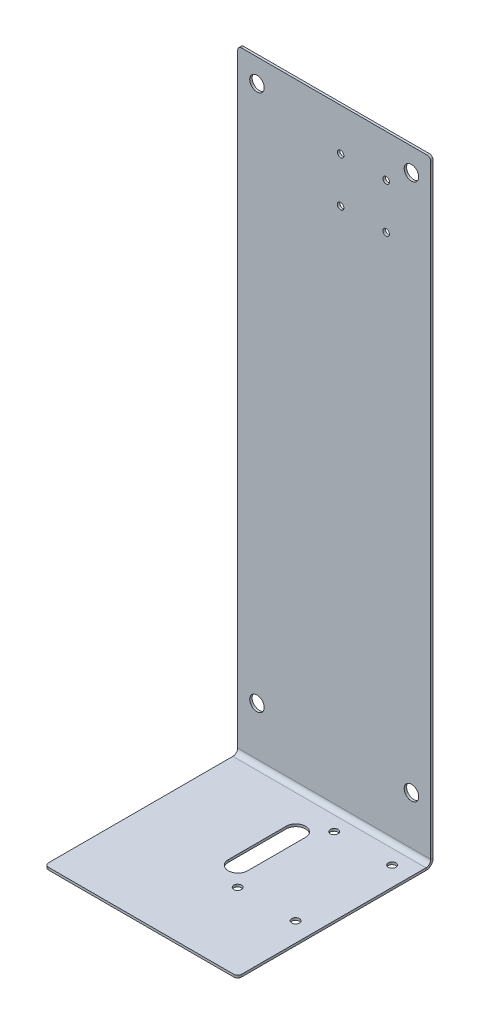
ISO-10303-21;
HEADER;
FILE_DESCRIPTION(('STEP AP214'),'2;1');
FILE_NAME('part.step','',(''),(''),'','','');
FILE_SCHEMA(('AUTOMOTIVE_DESIGN { 1 0 10303 214 1 1 1 1 }'));
ENDSEC;
DATA;
#1=APPLICATION_CONTEXT('core data for automotive mechanical design processes');
#2=APPLICATION_PROTOCOL_DEFINITION('international standard','automotive_design',2000,#1);
#3=PRODUCT_CONTEXT('',#1,'mechanical');
#4=PRODUCT('Part','Part','',(#3));
#5=PRODUCT_RELATED_PRODUCT_CATEGORY('part','',(#4));
#6=PRODUCT_DEFINITION_FORMATION('','',#4);
#7=PRODUCT_DEFINITION_CONTEXT('part definition',#1,'design');
#8=PRODUCT_DEFINITION('design','',#6,#7);
#9=PRODUCT_DEFINITION_SHAPE('','',#8);
#10=(LENGTH_UNIT() NAMED_UNIT(*) SI_UNIT(.MILLI.,.METRE.));
#11=(NAMED_UNIT(*) PLANE_ANGLE_UNIT() SI_UNIT($,.RADIAN.));
#12=(NAMED_UNIT(*) SI_UNIT($,.STERADIAN.) SOLID_ANGLE_UNIT());
#13=UNCERTAINTY_MEASURE_WITH_UNIT(LENGTH_MEASURE(1.E-05),#10,'distance_accuracy_value','');
#14=(GEOMETRIC_REPRESENTATION_CONTEXT(3) GLOBAL_UNCERTAINTY_ASSIGNED_CONTEXT((#13)) GLOBAL_UNIT_ASSIGNED_CONTEXT((#10,
#11,#12)) REPRESENTATION_CONTEXT('',''));
#15=CARTESIAN_POINT('',(0.,0.,0.));
#16=DIRECTION('',(0.,0.,1.));
#17=DIRECTION('',(1.,0.,0.));
#18=AXIS2_PLACEMENT_3D('',#15,#16,#17);
#19=CARTESIAN_POINT('',(-6.16710776156593,-200.025,66.6750000000004));
#20=DIRECTION('',(-1.,0.,0.));
#21=DIRECTION('',(0.,0.,-1.));
#22=AXIS2_PLACEMENT_3D('',#19,#20,#21);
#23=PLANE('',#22);
#24=DIRECTION('',(0.,1.,0.));
#25=VECTOR('',#24,1.);
#26=CARTESIAN_POINT('',(-6.16710776156593,-200.025,66.6750000000004));
#27=LINE('',#26,#25);
#28=CARTESIAN_POINT('',(-6.16710776156593,-201.6125,66.6750000000004));
#29=VERTEX_POINT('',#28);
#30=CARTESIAN_POINT('',(-6.16710776156593,-200.025,66.6750000000004));
#31=VERTEX_POINT('',#30);
#32=EDGE_CURVE('E329',#29,#31,#27,.T.);
#33=ORIENTED_EDGE('',*,*,#32,.F.);
#34=DIRECTION('',(0.,0.,-1.));
#35=VECTOR('',#34,1.);
#36=CARTESIAN_POINT('',(-6.16710776156593,-201.6125,130.175));
#37=LINE('',#36,#35);
#38=CARTESIAN_POINT('',(-6.16710776156593,-201.6125,28.5750000000004));
#39=VERTEX_POINT('',#38);
#40=EDGE_CURVE('E282',#29,#39,#37,.T.);
#41=ORIENTED_EDGE('',*,*,#40,.T.);
#42=DIRECTION('',(0.,1.,0.));
#43=VECTOR('',#42,1.);
#44=CARTESIAN_POINT('',(-6.16710776156593,-200.025,28.5750000000004));
#45=LINE('',#44,#43);
#46=CARTESIAN_POINT('',(-6.16710776156593,-200.025,28.5750000000004));
#47=VERTEX_POINT('',#46);
#48=EDGE_CURVE('E327',#39,#47,#45,.T.);
#49=ORIENTED_EDGE('',*,*,#48,.T.);
#50=DIRECTION('',(0.,0.,-1.));
#51=VECTOR('',#50,1.);
#52=CARTESIAN_POINT('',(-6.16710776156593,-200.025,66.6750000000004));
#53=LINE('',#52,#51);
#54=EDGE_CURVE('E219',#31,#47,#53,.T.);
#55=ORIENTED_EDGE('',*,*,#54,.F.);
#56=EDGE_LOOP('',(#33,#41,#49,#55));
#57=FACE_BOUND('',#56,.T.);
#58=ADVANCED_FACE('F53',(#57),#23,.F.);
#59=CARTESIAN_POINT('',(0.182892238434067,-200.025,28.5750000000004));
#60=DIRECTION('',(0.,-1.,0.));
#61=DIRECTION('',(0.,0.,-1.));
#62=AXIS2_PLACEMENT_3D('',#59,#60,#61);
#63=CYLINDRICAL_SURFACE('',#62,6.35);
#64=ORIENTED_EDGE('',*,*,#48,.F.);
#65=CARTESIAN_POINT('',(0.182892238434067,-201.6125,28.5750000000004));
#66=DIRECTION('',(0.,1.,0.));
#67=DIRECTION('',(0.,0.,1.));
#68=AXIS2_PLACEMENT_3D('',#65,#66,#67);
#69=CIRCLE('',#68,6.35);
#70=CARTESIAN_POINT('',(6.53289223843406,-201.6125,28.5750000000004));
#71=VERTEX_POINT('',#70);
#72=EDGE_CURVE('E278',#71,#39,#69,.T.);
#73=ORIENTED_EDGE('',*,*,#72,.F.);
#74=DIRECTION('',(0.,1.,0.));
#75=VECTOR('',#74,1.);
#76=CARTESIAN_POINT('',(6.53289223843407,-200.025,28.5750000000004));
#77=LINE('',#76,#75);
#78=CARTESIAN_POINT('',(6.53289223843407,-200.025,28.5750000000004));
#79=VERTEX_POINT('',#78);
#80=EDGE_CURVE('E325',#71,#79,#77,.T.);
#81=ORIENTED_EDGE('',*,*,#80,.T.);
#82=CARTESIAN_POINT('',(0.182892238434067,-200.025,28.5750000000004));
#83=DIRECTION('',(0.,1.,0.));
#84=DIRECTION('',(0.,0.,1.));
#85=AXIS2_PLACEMENT_3D('',#82,#83,#84);
#86=CIRCLE('',#85,6.35);
#87=EDGE_CURVE('E222',#79,#47,#86,.T.);
#88=ORIENTED_EDGE('',*,*,#87,.T.);
#89=EDGE_LOOP('',(#64,#73,#81,#88));
#90=FACE_BOUND('',#89,.T.);
#91=ADVANCED_FACE('F415',(#90),#63,.F.);
#92=CARTESIAN_POINT('',(6.53289223843407,-200.025,66.6750000000004));
#93=DIRECTION('',(-1.,0.,0.));
#94=DIRECTION('',(0.,0.,-1.));
#95=AXIS2_PLACEMENT_3D('',#92,#93,#94);
#96=PLANE('',#95);
#97=ORIENTED_EDGE('',*,*,#80,.F.);
#98=DIRECTION('',(0.,0.,-1.));
#99=VECTOR('',#98,1.);
#100=CARTESIAN_POINT('',(6.53289223843406,-201.6125,130.175));
#101=LINE('',#100,#99);
#102=CARTESIAN_POINT('',(6.53289223843406,-201.6125,66.6750000000004));
#103=VERTEX_POINT('',#102);
#104=EDGE_CURVE('E272',#103,#71,#101,.T.);
#105=ORIENTED_EDGE('',*,*,#104,.F.);
#106=DIRECTION('',(0.,1.,0.));
#107=VECTOR('',#106,1.);
#108=CARTESIAN_POINT('',(6.53289223843406,-200.025,66.6750000000004));
#109=LINE('',#108,#107);
#110=CARTESIAN_POINT('',(6.53289223843406,-200.025,66.6750000000004));
#111=VERTEX_POINT('',#110);
#112=EDGE_CURVE('E188',#103,#111,#109,.T.);
#113=ORIENTED_EDGE('',*,*,#112,.T.);
#114=DIRECTION('',(0.,0.,-1.));
#115=VECTOR('',#114,1.);
#116=CARTESIAN_POINT('',(6.53289223843407,-200.025,66.6750000000004));
#117=LINE('',#116,#115);
#118=EDGE_CURVE('E213',#111,#79,#117,.T.);
#119=ORIENTED_EDGE('',*,*,#118,.T.);
#120=EDGE_LOOP('',(#97,#105,#113,#119));
#121=FACE_BOUND('',#120,.T.);
#122=ADVANCED_FACE('F421',(#121),#96,.T.);
#123=CARTESIAN_POINT('',(-63.5,203.2,3.175));
#124=DIRECTION('',(0.,-1.,0.));
#125=DIRECTION('',(-1.,0.,0.));
#126=AXIS2_PLACEMENT_3D('',#123,#124,#125);
#127=PLANE('',#126);
#128=DIRECTION('',(-1.,0.,0.));
#129=VECTOR('',#128,1.);
#130=CARTESIAN_POINT('',(0.,203.2,1.5875));
#131=LINE('',#130,#129);
#132=CARTESIAN_POINT('',(60.96,203.2,1.5875));
#133=VERTEX_POINT('',#132);
#134=CARTESIAN_POINT('',(-60.96,203.2,1.5875));
#135=VERTEX_POINT('',#134);
#136=EDGE_CURVE('E269',#133,#135,#131,.T.);
#137=ORIENTED_EDGE('',*,*,#136,.T.);
#138=DIRECTION('',(0.,0.,-1.));
#139=VECTOR('',#138,1.);
#140=CARTESIAN_POINT('',(-60.96,203.2,3.175));
#141=LINE('',#140,#139);
#142=CARTESIAN_POINT('',(-60.96,203.2,3.175));
#143=VERTEX_POINT('',#142);
#144=EDGE_CURVE('E334',#135,#143,#141,.F.);
#145=ORIENTED_EDGE('',*,*,#144,.T.);
#146=DIRECTION('',(-1.,0.,0.));
#147=VECTOR('',#146,1.);
#148=CARTESIAN_POINT('',(-63.5,203.2,3.175));
#149=LINE('',#148,#147);
#150=CARTESIAN_POINT('',(60.96,203.2,3.175));
#151=VERTEX_POINT('',#150);
#152=EDGE_CURVE('E208',#151,#143,#149,.T.);
#153=ORIENTED_EDGE('',*,*,#152,.F.);
#154=DIRECTION('',(0.,0.,-1.));
#155=VECTOR('',#154,1.);
#156=CARTESIAN_POINT('',(60.96,203.2,3.175));
#157=LINE('',#156,#155);
#158=EDGE_CURVE('E331',#151,#133,#157,.T.);
#159=ORIENTED_EDGE('',*,*,#158,.T.);
#160=EDGE_LOOP('',(#137,#145,#153,#159));
#161=FACE_BOUND('',#160,.T.);
#162=ADVANCED_FACE('F399',(#161),#127,.F.);
#163=CARTESIAN_POINT('',(-63.5,-203.2,3.175));
#164=DIRECTION('',(1.,0.,0.));
#165=DIRECTION('',(0.,-1.,0.));
#166=AXIS2_PLACEMENT_3D('',#163,#164,#165);
#167=PLANE('',#166);
#168=DIRECTION('',(0.,-1.,0.));
#169=VECTOR('',#168,1.);
#170=CARTESIAN_POINT('',(-63.5,-203.2,3.175));
#171=LINE('',#170,#169);
#172=CARTESIAN_POINT('',(-63.5,200.66,3.175));
#173=VERTEX_POINT('',#172);
#174=CARTESIAN_POINT('',(-63.5,-196.85,3.175));
#175=VERTEX_POINT('',#174);
#176=EDGE_CURVE('E167',#173,#175,#171,.T.);
#177=ORIENTED_EDGE('',*,*,#176,.F.);
#178=DIRECTION('',(0.,0.,-1.));
#179=VECTOR('',#178,1.);
#180=CARTESIAN_POINT('',(-63.5,200.66,3.175));
#181=LINE('',#180,#179);
#182=CARTESIAN_POINT('',(-63.5,200.66,1.5875));
#183=VERTEX_POINT('',#182);
#184=EDGE_CURVE('E340',#173,#183,#181,.T.);
#185=ORIENTED_EDGE('',*,*,#184,.T.);
#186=DIRECTION('',(0.,1.,0.));
#187=VECTOR('',#186,1.);
#188=CARTESIAN_POINT('',(-63.5,0.,1.5875));
#189=LINE('',#188,#187);
#190=CARTESIAN_POINT('',(-63.5,-196.85,1.5875));
#191=VERTEX_POINT('',#190);
#192=EDGE_CURVE('E184',#183,#191,#189,.F.);
#193=ORIENTED_EDGE('',*,*,#192,.T.);
#194=DIRECTION('',(0.,0.,1.));
#195=VECTOR('',#194,1.);
#196=CARTESIAN_POINT('',(-63.5,-196.85,3.175));
#197=LINE('',#196,#195);
#198=EDGE_CURVE('E180',#191,#175,#197,.T.);
#199=ORIENTED_EDGE('',*,*,#198,.T.);
#200=EDGE_LOOP('',(#177,#185,#193,#199));
#201=FACE_BOUND('',#200,.T.);
#202=ADVANCED_FACE('F182',(#201),#167,.F.);
#203=CARTESIAN_POINT('',(-63.5,-196.85,6.34999999999999));
#204=DIRECTION('',(-1.,0.,0.));
#205=DIRECTION('',(0.,0.,1.));
#206=AXIS2_PLACEMENT_3D('',#203,#204,#205);
#207=PLANE('',#206);
#208=ORIENTED_EDGE('',*,*,#198,.F.);
#209=CARTESIAN_POINT('',(-63.5,-196.85,6.34999999999999));
#210=DIRECTION('',(1.,0.,0.));
#211=DIRECTION('',(0.,0.,-1.));
#212=AXIS2_PLACEMENT_3D('',#209,#210,#211);
#213=CIRCLE('',#212,4.7625);
#214=CARTESIAN_POINT('',(-63.5,-201.6125,6.34999999999999));
#215=VERTEX_POINT('',#214);
#216=EDGE_CURVE('E258',#215,#191,#213,.T.);
#217=ORIENTED_EDGE('',*,*,#216,.F.);
#218=DIRECTION('',(0.,1.,0.));
#219=VECTOR('',#218,1.);
#220=CARTESIAN_POINT('',(-63.5,-200.025,6.34999999999999));
#221=LINE('',#220,#219);
#222=CARTESIAN_POINT('',(-63.5,-200.025,6.34999999999999));
#223=VERTEX_POINT('',#222);
#224=EDGE_CURVE('E189',#215,#223,#221,.T.);
#225=ORIENTED_EDGE('',*,*,#224,.T.);
#226=CARTESIAN_POINT('',(-63.5,-196.85,6.34999999999999));
#227=DIRECTION('',(1.,0.,0.));
#228=DIRECTION('',(0.,0.,-1.));
#229=AXIS2_PLACEMENT_3D('',#226,#227,#228);
#230=CIRCLE('',#229,3.175);
#231=EDGE_CURVE('E193',#223,#175,#230,.T.);
#232=ORIENTED_EDGE('',*,*,#231,.T.);
#233=EDGE_LOOP('',(#208,#217,#225,#232));
#234=FACE_BOUND('',#233,.T.);
#235=ADVANCED_FACE('F194',(#234),#207,.T.);
#236=CARTESIAN_POINT('',(-63.5,-200.025,130.175));
#237=DIRECTION('',(-1.,0.,0.));
#238=DIRECTION('',(0.,0.,-1.));
#239=AXIS2_PLACEMENT_3D('',#236,#237,#238);
#240=PLANE('',#239);
#241=DIRECTION('',(0.,0.,-1.));
#242=VECTOR('',#241,1.);
#243=CARTESIAN_POINT('',(-63.5,-201.6125,130.175));
#244=LINE('',#243,#242);
#245=CARTESIAN_POINT('',(-63.5,-201.6125,127.635));
#246=VERTEX_POINT('',#245);
#247=EDGE_CURVE('E253',#246,#215,#244,.T.);
#248=ORIENTED_EDGE('',*,*,#247,.F.);
#249=DIRECTION('',(0.,1.,0.));
#250=VECTOR('',#249,1.);
#251=CARTESIAN_POINT('',(-63.5,-200.025,127.635));
#252=LINE('',#251,#250);
#253=CARTESIAN_POINT('',(-63.5,-200.025,127.635));
#254=VERTEX_POINT('',#253);
#255=EDGE_CURVE('E349',#246,#254,#252,.T.);
#256=ORIENTED_EDGE('',*,*,#255,.T.);
#257=DIRECTION('',(0.,0.,-1.));
#258=VECTOR('',#257,1.);
#259=CARTESIAN_POINT('',(-63.5,-200.025,130.175));
#260=LINE('',#259,#258);
#261=EDGE_CURVE('E241',#254,#223,#260,.T.);
#262=ORIENTED_EDGE('',*,*,#261,.T.);
#263=ORIENTED_EDGE('',*,*,#224,.F.);
#264=EDGE_LOOP('',(#248,#256,#262,#263));
#265=FACE_BOUND('',#264,.T.);
#266=ADVANCED_FACE('F369',(#265),#240,.T.);
#267=CARTESIAN_POINT('',(-63.5,-200.025,130.175));
#268=DIRECTION('',(0.,0.,1.));
#269=DIRECTION('',(-1.,0.,0.));
#270=AXIS2_PLACEMENT_3D('',#267,#268,#269);
#271=PLANE('',#270);
#272=DIRECTION('',(-1.,0.,0.));
#273=VECTOR('',#272,1.);
#274=CARTESIAN_POINT('',(-63.5,-200.025,130.175));
#275=LINE('',#274,#273);
#276=CARTESIAN_POINT('',(60.96,-200.025,130.175));
#277=VERTEX_POINT('',#276);
#278=CARTESIAN_POINT('',(-60.96,-200.025,130.175));
#279=VERTEX_POINT('',#278);
#280=EDGE_CURVE('E243',#277,#279,#275,.T.);
#281=ORIENTED_EDGE('',*,*,#280,.T.);
#282=DIRECTION('',(0.,1.,0.));
#283=VECTOR('',#282,1.);
#284=CARTESIAN_POINT('',(-60.96,-200.025,130.175));
#285=LINE('',#284,#283);
#286=CARTESIAN_POINT('',(-60.96,-201.6125,130.175));
#287=VERTEX_POINT('',#286);
#288=EDGE_CURVE('E74',#279,#287,#285,.F.);
#289=ORIENTED_EDGE('',*,*,#288,.T.);
#290=DIRECTION('',(1.,0.,0.));
#291=VECTOR('',#290,1.);
#292=CARTESIAN_POINT('',(-63.5,-201.6125,130.175));
#293=LINE('',#292,#291);
#294=CARTESIAN_POINT('',(60.96,-201.6125,130.175));
#295=VERTEX_POINT('',#294);
#296=EDGE_CURVE('E259',#295,#287,#293,.F.);
#297=ORIENTED_EDGE('',*,*,#296,.F.);
#298=DIRECTION('',(0.,-1.,0.));
#299=VECTOR('',#298,1.);
#300=CARTESIAN_POINT('',(60.96,-200.025,130.175));
#301=LINE('',#300,#299);
#302=EDGE_CURVE('E356',#295,#277,#301,.F.);
#303=ORIENTED_EDGE('',*,*,#302,.T.);
#304=EDGE_LOOP('',(#281,#289,#297,#303));
#305=FACE_BOUND('',#304,.T.);
#306=ADVANCED_FACE('F375',(#305),#271,.T.);
#307=CARTESIAN_POINT('',(63.5,-200.025,130.175));
#308=DIRECTION('',(-1.,0.,0.));
#309=DIRECTION('',(0.,0.,-1.));
#310=AXIS2_PLACEMENT_3D('',#307,#308,#309);
#311=PLANE('',#310);
#312=DIRECTION('',(0.,0.,-1.));
#313=VECTOR('',#312,1.);
#314=CARTESIAN_POINT('',(63.5,-200.025,130.175));
#315=LINE('',#314,#313);
#316=CARTESIAN_POINT('',(63.5,-200.025,127.635));
#317=VERTEX_POINT('',#316);
#318=CARTESIAN_POINT('',(63.5,-200.025,6.34999999999999));
#319=VERTEX_POINT('',#318);
#320=EDGE_CURVE('E237',#317,#319,#315,.T.);
#321=ORIENTED_EDGE('',*,*,#320,.F.);
#322=DIRECTION('',(0.,1.,0.));
#323=VECTOR('',#322,1.);
#324=CARTESIAN_POINT('',(63.5,-200.025,127.635));
#325=LINE('',#324,#323);
#326=CARTESIAN_POINT('',(63.5,-201.6125,127.635));
#327=VERTEX_POINT('',#326);
#328=EDGE_CURVE('E13',#317,#327,#325,.F.);
#329=ORIENTED_EDGE('',*,*,#328,.T.);
#330=DIRECTION('',(0.,0.,-1.));
#331=VECTOR('',#330,1.);
#332=CARTESIAN_POINT('',(63.5,-201.6125,130.175));
#333=LINE('',#332,#331);
#334=CARTESIAN_POINT('',(63.5,-201.6125,6.34999999999999));
#335=VERTEX_POINT('',#334);
#336=EDGE_CURVE('E254',#327,#335,#333,.T.);
#337=ORIENTED_EDGE('',*,*,#336,.T.);
#338=DIRECTION('',(0.,1.,0.));
#339=VECTOR('',#338,1.);
#340=CARTESIAN_POINT('',(63.5,-200.025,6.34999999999999));
#341=LINE('',#340,#339);
#342=EDGE_CURVE('E320',#335,#319,#341,.T.);
#343=ORIENTED_EDGE('',*,*,#342,.T.);
#344=EDGE_LOOP('',(#321,#329,#337,#343));
#345=FACE_BOUND('',#344,.T.);
#346=ADVANCED_FACE('F379',(#345),#311,.F.);
#347=CARTESIAN_POINT('',(63.5,-196.85,6.34999999999999));
#348=DIRECTION('',(1.,0.,0.));
#349=DIRECTION('',(0.,0.,-1.));
#350=AXIS2_PLACEMENT_3D('',#347,#348,#349);
#351=PLANE('',#350);
#352=ORIENTED_EDGE('',*,*,#342,.F.);
#353=CARTESIAN_POINT('',(63.5,-196.85,6.34999999999999));
#354=DIRECTION('',(1.,0.,0.));
#355=DIRECTION('',(0.,0.,-1.));
#356=AXIS2_PLACEMENT_3D('',#353,#354,#355);
#357=CIRCLE('',#356,4.7625);
#358=CARTESIAN_POINT('',(63.5,-196.85,1.5875));
#359=VERTEX_POINT('',#358);
#360=EDGE_CURVE('E255',#359,#335,#357,.F.);
#361=ORIENTED_EDGE('',*,*,#360,.F.);
#362=DIRECTION('',(0.,0.,1.));
#363=VECTOR('',#362,1.);
#364=CARTESIAN_POINT('',(63.5,-196.85,3.175));
#365=LINE('',#364,#363);
#366=CARTESIAN_POINT('',(63.5,-196.85,3.175));
#367=VERTEX_POINT('',#366);
#368=EDGE_CURVE('E199',#359,#367,#365,.T.);
#369=ORIENTED_EDGE('',*,*,#368,.T.);
#370=CARTESIAN_POINT('',(63.5,-196.85,6.34999999999999));
#371=DIRECTION('',(-1.,0.,0.));
#372=DIRECTION('',(0.,0.,1.));
#373=AXIS2_PLACEMENT_3D('',#370,#371,#372);
#374=CIRCLE('',#373,3.175);
#375=EDGE_CURVE('E200',#367,#319,#374,.T.);
#376=ORIENTED_EDGE('',*,*,#375,.T.);
#377=EDGE_LOOP('',(#352,#361,#369,#376));
#378=FACE_BOUND('',#377,.T.);
#379=ADVANCED_FACE('F383',(#378),#351,.T.);
#380=CARTESIAN_POINT('',(4.20875,175.39,3.175));
#381=DIRECTION('',(0.,0.,-1.));
#382=DIRECTION('',(-1.,0.,0.));
#383=AXIS2_PLACEMENT_3D('',#380,#381,#382);
#384=CYLINDRICAL_SURFACE('',#383,2.14999999999998);
#385=CARTESIAN_POINT('',(4.20875,175.39,3.175));
#386=DIRECTION('',(0.,0.,1.));
#387=DIRECTION('',(1.,0.,0.));
#388=AXIS2_PLACEMENT_3D('',#385,#386,#387);
#389=CIRCLE('',#388,2.14999999999998);
#390=CARTESIAN_POINT('',(6.35874999999999,175.39,3.175));
#391=VERTEX_POINT('',#390);
#392=EDGE_CURVE('E266',#391,#391,#389,.T.);
#393=ORIENTED_EDGE('',*,*,#392,.T.);
#394=EDGE_LOOP('',(#393));
#395=FACE_BOUND('',#394,.T.);
#396=CARTESIAN_POINT('',(4.20875,175.39,1.5875));
#397=DIRECTION('',(0.,0.,1.));
#398=DIRECTION('',(1.,0.,0.));
#399=AXIS2_PLACEMENT_3D('',#396,#397,#398);
#400=CIRCLE('',#399,2.14999999999998);
#401=CARTESIAN_POINT('',(6.35874999999999,175.39,1.5875));
#402=VERTEX_POINT('',#401);
#403=EDGE_CURVE('E297',#402,#402,#400,.T.);
#404=ORIENTED_EDGE('',*,*,#403,.F.);
#405=EDGE_LOOP('',(#404));
#406=FACE_BOUND('',#405,.T.);
#407=ADVANCED_FACE('F447',(#395,#406),#384,.F.);
#408=CARTESIAN_POINT('',(50.8,-165.1,3.175));
#409=DIRECTION('',(0.,0.,-1.));
#410=DIRECTION('',(-1.,0.,0.));
#411=AXIS2_PLACEMENT_3D('',#408,#409,#410);
#412=CYLINDRICAL_SURFACE('',#411,4.7625);
#413=CARTESIAN_POINT('',(50.8,-165.1,3.175));
#414=DIRECTION('',(0.,0.,1.));
#415=DIRECTION('',(1.,0.,0.));
#416=AXIS2_PLACEMENT_3D('',#413,#414,#415);
#417=CIRCLE('',#416,4.7625);
#418=CARTESIAN_POINT('',(55.5625,-165.1,3.175));
#419=VERTEX_POINT('',#418);
#420=EDGE_CURVE('E500',#419,#419,#417,.T.);
#421=ORIENTED_EDGE('',*,*,#420,.T.);
#422=EDGE_LOOP('',(#421));
#423=FACE_BOUND('',#422,.T.);
#424=CARTESIAN_POINT('',(50.8,-165.1,1.5875));
#425=DIRECTION('',(0.,0.,1.));
#426=DIRECTION('',(1.,0.,0.));
#427=AXIS2_PLACEMENT_3D('',#424,#425,#426);
#428=CIRCLE('',#427,4.7625);
#429=CARTESIAN_POINT('',(55.5625,-165.1,1.5875));
#430=VERTEX_POINT('',#429);
#431=EDGE_CURVE('E300',#430,#430,#428,.T.);
#432=ORIENTED_EDGE('',*,*,#431,.F.);
#433=EDGE_LOOP('',(#432));
#434=FACE_BOUND('',#433,.T.);
#435=ADVANCED_FACE('F450',(#423,#434),#412,.F.);
#436=CARTESIAN_POINT('',(-50.8,-165.1,3.175));
#437=DIRECTION('',(0.,0.,-1.));
#438=DIRECTION('',(-1.,0.,0.));
#439=AXIS2_PLACEMENT_3D('',#436,#437,#438);
#440=CYLINDRICAL_SURFACE('',#439,4.7625);
#441=CARTESIAN_POINT('',(-50.8,-165.1,3.175));
#442=DIRECTION('',(0.,0.,1.));
#443=DIRECTION('',(1.,0.,0.));
#444=AXIS2_PLACEMENT_3D('',#441,#442,#443);
#445=CIRCLE('',#444,4.7625);
#446=CARTESIAN_POINT('',(-46.0375,-165.1,3.175));
#447=VERTEX_POINT('',#446);
#448=EDGE_CURVE('E497',#447,#447,#445,.T.);
#449=ORIENTED_EDGE('',*,*,#448,.T.);
#450=EDGE_LOOP('',(#449));
#451=FACE_BOUND('',#450,.T.);
#452=CARTESIAN_POINT('',(-50.8,-165.1,1.5875));
#453=DIRECTION('',(0.,0.,1.));
#454=DIRECTION('',(1.,0.,0.));
#455=AXIS2_PLACEMENT_3D('',#452,#453,#454);
#456=CIRCLE('',#455,4.7625);
#457=CARTESIAN_POINT('',(-46.0375,-165.1,1.5875));
#458=VERTEX_POINT('',#457);
#459=EDGE_CURVE('E303',#458,#458,#456,.T.);
#460=ORIENTED_EDGE('',*,*,#459,.F.);
#461=EDGE_LOOP('',(#460));
#462=FACE_BOUND('',#461,.T.);
#463=ADVANCED_FACE('F454',(#451,#462),#440,.F.);
#464=CARTESIAN_POINT('',(50.8,187.96,3.175));
#465=DIRECTION('',(0.,0.,-1.));
#466=DIRECTION('',(-1.,0.,0.));
#467=AXIS2_PLACEMENT_3D('',#464,#465,#466);
#468=CYLINDRICAL_SURFACE('',#467,4.7625);
#469=CARTESIAN_POINT('',(50.8,187.96,3.175));
#470=DIRECTION('',(0.,0.,1.));
#471=DIRECTION('',(1.,0.,0.));
#472=AXIS2_PLACEMENT_3D('',#469,#470,#471);
#473=CIRCLE('',#472,4.7625);
#474=CARTESIAN_POINT('',(55.5625,187.96,3.175));
#475=VERTEX_POINT('',#474);
#476=EDGE_CURVE('E494',#475,#475,#473,.T.);
#477=ORIENTED_EDGE('',*,*,#476,.T.);
#478=EDGE_LOOP('',(#477));
#479=FACE_BOUND('',#478,.T.);
#480=CARTESIAN_POINT('',(50.8,187.96,1.5875));
#481=DIRECTION('',(0.,0.,1.));
#482=DIRECTION('',(1.,0.,0.));
#483=AXIS2_PLACEMENT_3D('',#480,#481,#482);
#484=CIRCLE('',#483,4.7625);
#485=CARTESIAN_POINT('',(55.5625,187.96,1.5875));
#486=VERTEX_POINT('',#485);
#487=EDGE_CURVE('E306',#486,#486,#484,.T.);
#488=ORIENTED_EDGE('',*,*,#487,.F.);
#489=EDGE_LOOP('',(#488));
#490=FACE_BOUND('',#489,.T.);
#491=ADVANCED_FACE('F458',(#479,#490),#468,.F.);
#492=CARTESIAN_POINT('',(34.2087499999999,145.69,3.175));
#493=DIRECTION('',(0.,0.,-1.));
#494=DIRECTION('',(-1.,0.,0.));
#495=AXIS2_PLACEMENT_3D('',#492,#493,#494);
#496=CYLINDRICAL_SURFACE('',#495,2.15);
#497=CARTESIAN_POINT('',(34.2087499999999,145.69,3.175));
#498=DIRECTION('',(0.,0.,1.));
#499=DIRECTION('',(1.,0.,0.));
#500=AXIS2_PLACEMENT_3D('',#497,#498,#499);
#501=CIRCLE('',#500,2.15);
#502=CARTESIAN_POINT('',(36.3587499999999,145.69,3.175));
#503=VERTEX_POINT('',#502);
#504=EDGE_CURVE('E491',#503,#503,#501,.T.);
#505=ORIENTED_EDGE('',*,*,#504,.T.);
#506=EDGE_LOOP('',(#505));
#507=FACE_BOUND('',#506,.T.);
#508=CARTESIAN_POINT('',(34.2087499999999,145.69,1.5875));
#509=DIRECTION('',(0.,0.,1.));
#510=DIRECTION('',(1.,0.,0.));
#511=AXIS2_PLACEMENT_3D('',#508,#509,#510);
#512=CIRCLE('',#511,2.15);
#513=CARTESIAN_POINT('',(36.3587499999999,145.69,1.5875));
#514=VERTEX_POINT('',#513);
#515=EDGE_CURVE('E309',#514,#514,#512,.T.);
#516=ORIENTED_EDGE('',*,*,#515,.F.);
#517=EDGE_LOOP('',(#516));
#518=FACE_BOUND('',#517,.T.);
#519=ADVANCED_FACE('F462',(#507,#518),#496,.F.);
#520=CARTESIAN_POINT('',(34.2087499999997,175.39,3.175));
#521=DIRECTION('',(0.,0.,-1.));
#522=DIRECTION('',(-1.,0.,0.));
#523=AXIS2_PLACEMENT_3D('',#520,#521,#522);
#524=CYLINDRICAL_SURFACE('',#523,2.14999999999998);
#525=CARTESIAN_POINT('',(34.2087499999997,175.39,3.175));
#526=DIRECTION('',(0.,0.,1.));
#527=DIRECTION('',(1.,0.,0.));
#528=AXIS2_PLACEMENT_3D('',#525,#526,#527);
#529=CIRCLE('',#528,2.14999999999998);
#530=CARTESIAN_POINT('',(36.3587499999997,175.39,3.175));
#531=VERTEX_POINT('',#530);
#532=EDGE_CURVE('E486',#531,#531,#529,.T.);
#533=ORIENTED_EDGE('',*,*,#532,.T.);
#534=EDGE_LOOP('',(#533));
#535=FACE_BOUND('',#534,.T.);
#536=CARTESIAN_POINT('',(34.2087499999997,175.39,1.5875));
#537=DIRECTION('',(0.,0.,1.));
#538=DIRECTION('',(1.,0.,0.));
#539=AXIS2_PLACEMENT_3D('',#536,#537,#538);
#540=CIRCLE('',#539,2.14999999999998);
#541=CARTESIAN_POINT('',(36.3587499999997,175.39,1.5875));
#542=VERTEX_POINT('',#541);
#543=EDGE_CURVE('E312',#542,#542,#540,.T.);
#544=ORIENTED_EDGE('',*,*,#543,.F.);
#545=EDGE_LOOP('',(#544));
#546=FACE_BOUND('',#545,.T.);
#547=ADVANCED_FACE('F466',(#535,#546),#524,.F.);
#548=CARTESIAN_POINT('',(4.20875,145.69,3.175));
#549=DIRECTION('',(0.,0.,-1.));
#550=DIRECTION('',(-1.,0.,0.));
#551=AXIS2_PLACEMENT_3D('',#548,#549,#550);
#552=CYLINDRICAL_SURFACE('',#551,2.15);
#553=CARTESIAN_POINT('',(4.20875,145.69,3.175));
#554=DIRECTION('',(0.,0.,1.));
#555=DIRECTION('',(1.,0.,0.));
#556=AXIS2_PLACEMENT_3D('',#553,#554,#555);
#557=CIRCLE('',#556,2.15);
#558=CARTESIAN_POINT('',(6.35875000000001,145.69,3.175));
#559=VERTEX_POINT('',#558);
#560=EDGE_CURVE('E484',#559,#559,#557,.T.);
#561=ORIENTED_EDGE('',*,*,#560,.T.);
#562=EDGE_LOOP('',(#561));
#563=FACE_BOUND('',#562,.T.);
#564=CARTESIAN_POINT('',(4.20875,145.69,1.5875));
#565=DIRECTION('',(0.,0.,1.));
#566=DIRECTION('',(1.,0.,0.));
#567=AXIS2_PLACEMENT_3D('',#564,#565,#566);
#568=CIRCLE('',#567,2.15);
#569=CARTESIAN_POINT('',(6.35875000000001,145.69,1.5875));
#570=VERTEX_POINT('',#569);
#571=EDGE_CURVE('E315',#570,#570,#568,.T.);
#572=ORIENTED_EDGE('',*,*,#571,.F.);
#573=EDGE_LOOP('',(#572));
#574=FACE_BOUND('',#573,.T.);
#575=ADVANCED_FACE('F470',(#563,#574),#552,.F.);
#576=CARTESIAN_POINT('',(-50.8,187.96,3.175));
#577=DIRECTION('',(0.,0.,-1.));
#578=DIRECTION('',(-1.,0.,0.));
#579=AXIS2_PLACEMENT_3D('',#576,#577,#578);
#580=CYLINDRICAL_SURFACE('',#579,4.7625);
#581=CARTESIAN_POINT('',(-50.8,187.96,3.175));
#582=DIRECTION('',(0.,0.,1.));
#583=DIRECTION('',(1.,0.,0.));
#584=AXIS2_PLACEMENT_3D('',#581,#582,#583);
#585=CIRCLE('',#584,4.7625);
#586=CARTESIAN_POINT('',(-46.0375,187.96,3.175));
#587=VERTEX_POINT('',#586);
#588=EDGE_CURVE('E177',#587,#587,#585,.T.);
#589=ORIENTED_EDGE('',*,*,#588,.T.);
#590=EDGE_LOOP('',(#589));
#591=FACE_BOUND('',#590,.T.);
#592=CARTESIAN_POINT('',(-50.8,187.96,1.5875));
#593=DIRECTION('',(0.,0.,1.));
#594=DIRECTION('',(1.,0.,0.));
#595=AXIS2_PLACEMENT_3D('',#592,#593,#594);
#596=CIRCLE('',#595,4.7625);
#597=CARTESIAN_POINT('',(-46.0375,187.96,1.5875));
#598=VERTEX_POINT('',#597);
#599=EDGE_CURVE('E268',#598,#598,#596,.T.);
#600=ORIENTED_EDGE('',*,*,#599,.F.);
#601=EDGE_LOOP('',(#600));
#602=FACE_BOUND('',#601,.T.);
#603=ADVANCED_FACE('F430',(#591,#602),#580,.F.);
#604=CARTESIAN_POINT('',(0.182892238434069,-200.025,66.6750000000004));
#605=DIRECTION('',(0.,-1.,0.));
#606=DIRECTION('',(0.,0.,-1.));
#607=AXIS2_PLACEMENT_3D('',#604,#605,#606);
#608=CYLINDRICAL_SURFACE('',#607,6.35);
#609=CARTESIAN_POINT('',(0.182892238434069,-201.6125,66.6750000000004));
#610=DIRECTION('',(0.,1.,0.));
#611=DIRECTION('',(0.,0.,1.));
#612=AXIS2_PLACEMENT_3D('',#609,#610,#611);
#613=CIRCLE('',#612,6.35);
#614=EDGE_CURVE('E277',#29,#103,#613,.T.);
#615=ORIENTED_EDGE('',*,*,#614,.F.);
#616=ORIENTED_EDGE('',*,*,#32,.T.);
#617=CARTESIAN_POINT('',(0.182892238434069,-200.025,66.6750000000004));
#618=DIRECTION('',(0.,1.,0.));
#619=DIRECTION('',(0.,0.,1.));
#620=AXIS2_PLACEMENT_3D('',#617,#618,#619);
#621=CIRCLE('',#620,6.35);
#622=EDGE_CURVE('E216',#31,#111,#621,.T.);
#623=ORIENTED_EDGE('',*,*,#622,.T.);
#624=ORIENTED_EDGE('',*,*,#112,.F.);
#625=EDGE_LOOP('',(#615,#616,#623,#624));
#626=FACE_BOUND('',#625,.T.);
#627=ADVANCED_FACE('F426',(#626),#608,.F.);
#628=CARTESIAN_POINT('',(12.6999999999997,-200.025,79.375));
#629=DIRECTION('',(0.,-1.,0.));
#630=DIRECTION('',(0.,0.,-1.));
#631=AXIS2_PLACEMENT_3D('',#628,#629,#630);
#632=CYLINDRICAL_SURFACE('',#631,2.54);
#633=CARTESIAN_POINT('',(12.6999999999997,-200.025,79.375));
#634=DIRECTION('',(0.,1.,0.));
#635=DIRECTION('',(0.,0.,1.));
#636=AXIS2_PLACEMENT_3D('',#633,#634,#635);
#637=CIRCLE('',#636,2.54);
#638=CARTESIAN_POINT('',(12.6999999999997,-200.025,81.915));
#639=VERTEX_POINT('',#638);
#640=EDGE_CURVE('E225',#639,#639,#637,.T.);
#641=ORIENTED_EDGE('',*,*,#640,.T.);
#642=EDGE_LOOP('',(#641));
#643=FACE_BOUND('',#642,.T.);
#644=CARTESIAN_POINT('',(12.6999999999997,-201.6125,79.375));
#645=DIRECTION('',(0.,1.,0.));
#646=DIRECTION('',(0.,0.,1.));
#647=AXIS2_PLACEMENT_3D('',#644,#645,#646);
#648=CIRCLE('',#647,2.54);
#649=CARTESIAN_POINT('',(12.6999999999997,-201.6125,81.915));
#650=VERTEX_POINT('',#649);
#651=EDGE_CURVE('E281',#650,#650,#648,.T.);
#652=ORIENTED_EDGE('',*,*,#651,.F.);
#653=EDGE_LOOP('',(#652));
#654=FACE_BOUND('',#653,.T.);
#655=ADVANCED_FACE('F429',(#643,#654),#632,.F.);
#656=CARTESIAN_POINT('',(50.7999999999997,-200.025,79.3750000000004));
#657=DIRECTION('',(0.,-1.,0.));
#658=DIRECTION('',(0.,0.,-1.));
#659=AXIS2_PLACEMENT_3D('',#656,#657,#658);
#660=CYLINDRICAL_SURFACE('',#659,2.54);
#661=CARTESIAN_POINT('',(50.7999999999997,-200.025,79.3750000000004));
#662=DIRECTION('',(0.,1.,0.));
#663=DIRECTION('',(0.,0.,1.));
#664=AXIS2_PLACEMENT_3D('',#661,#662,#663);
#665=CIRCLE('',#664,2.54);
#666=CARTESIAN_POINT('',(50.7999999999997,-200.025,81.9150000000004));
#667=VERTEX_POINT('',#666);
#668=EDGE_CURVE('E228',#667,#667,#665,.T.);
#669=ORIENTED_EDGE('',*,*,#668,.T.);
#670=EDGE_LOOP('',(#669));
#671=FACE_BOUND('',#670,.T.);
#672=CARTESIAN_POINT('',(50.7999999999997,-201.6125,79.3750000000004));
#673=DIRECTION('',(0.,1.,0.));
#674=DIRECTION('',(0.,0.,1.));
#675=AXIS2_PLACEMENT_3D('',#672,#673,#674);
#676=CIRCLE('',#675,2.54);
#677=CARTESIAN_POINT('',(50.7999999999997,-201.6125,81.9150000000004));
#678=VERTEX_POINT('',#677);
#679=EDGE_CURVE('E289',#678,#678,#676,.T.);
#680=ORIENTED_EDGE('',*,*,#679,.F.);
#681=EDGE_LOOP('',(#680));
#682=FACE_BOUND('',#681,.T.);
#683=ADVANCED_FACE('F434',(#671,#682),#660,.F.);
#684=CARTESIAN_POINT('',(50.8000000000003,-200.025,15.8750000000004));
#685=DIRECTION('',(0.,-1.,0.));
#686=DIRECTION('',(0.,0.,-1.));
#687=AXIS2_PLACEMENT_3D('',#684,#685,#686);
#688=CYLINDRICAL_SURFACE('',#687,2.54);
#689=CARTESIAN_POINT('',(50.8000000000003,-200.025,15.8750000000004));
#690=DIRECTION('',(0.,1.,0.));
#691=DIRECTION('',(0.,0.,1.));
#692=AXIS2_PLACEMENT_3D('',#689,#690,#691);
#693=CIRCLE('',#692,2.54);
#694=CARTESIAN_POINT('',(50.8000000000003,-200.025,18.4150000000004));
#695=VERTEX_POINT('',#694);
#696=EDGE_CURVE('E231',#695,#695,#693,.T.);
#697=ORIENTED_EDGE('',*,*,#696,.T.);
#698=EDGE_LOOP('',(#697));
#699=FACE_BOUND('',#698,.T.);
#700=CARTESIAN_POINT('',(50.8000000000003,-201.6125,15.8750000000004));
#701=DIRECTION('',(0.,1.,0.));
#702=DIRECTION('',(0.,0.,1.));
#703=AXIS2_PLACEMENT_3D('',#700,#701,#702);
#704=CIRCLE('',#703,2.54);
#705=CARTESIAN_POINT('',(50.8000000000003,-201.6125,18.4150000000004));
#706=VERTEX_POINT('',#705);
#707=EDGE_CURVE('E292',#706,#706,#704,.T.);
#708=ORIENTED_EDGE('',*,*,#707,.F.);
#709=EDGE_LOOP('',(#708));
#710=FACE_BOUND('',#709,.T.);
#711=ADVANCED_FACE('F438',(#699,#710),#688,.F.);
#712=CARTESIAN_POINT('',(12.7000000000003,-200.025,15.875));
#713=DIRECTION('',(0.,-1.,0.));
#714=DIRECTION('',(0.,0.,-1.));
#715=AXIS2_PLACEMENT_3D('',#712,#713,#714);
#716=CYLINDRICAL_SURFACE('',#715,2.54);
#717=CARTESIAN_POINT('',(12.7000000000003,-200.025,15.875));
#718=DIRECTION('',(0.,1.,0.));
#719=DIRECTION('',(0.,0.,1.));
#720=AXIS2_PLACEMENT_3D('',#717,#718,#719);
#721=CIRCLE('',#720,2.54);
#722=CARTESIAN_POINT('',(12.7000000000003,-200.025,18.415));
#723=VERTEX_POINT('',#722);
#724=EDGE_CURVE('E234',#723,#723,#721,.T.);
#725=ORIENTED_EDGE('',*,*,#724,.T.);
#726=EDGE_LOOP('',(#725));
#727=FACE_BOUND('',#726,.T.);
#728=CARTESIAN_POINT('',(12.7000000000003,-201.6125,15.875));
#729=DIRECTION('',(0.,1.,0.));
#730=DIRECTION('',(0.,0.,1.));
#731=AXIS2_PLACEMENT_3D('',#728,#729,#730);
#732=CIRCLE('',#731,2.54);
#733=CARTESIAN_POINT('',(12.7000000000003,-201.6125,18.415));
#734=VERTEX_POINT('',#733);
#735=EDGE_CURVE('E261',#734,#734,#732,.T.);
#736=ORIENTED_EDGE('',*,*,#735,.F.);
#737=EDGE_LOOP('',(#736));
#738=FACE_BOUND('',#737,.T.);
#739=ADVANCED_FACE('F442',(#727,#738),#716,.F.);
#740=CARTESIAN_POINT('',(63.5,-203.2,3.175));
#741=DIRECTION('',(-1.,0.,0.));
#742=DIRECTION('',(0.,1.,0.));
#743=AXIS2_PLACEMENT_3D('',#740,#741,#742);
#744=PLANE('',#743);
#745=DIRECTION('',(0.,1.,0.));
#746=VECTOR('',#745,1.);
#747=CARTESIAN_POINT('',(63.5,0.,1.5875));
#748=LINE('',#747,#746);
#749=CARTESIAN_POINT('',(63.5,200.66,1.5875));
#750=VERTEX_POINT('',#749);
#751=EDGE_CURVE('E249',#359,#750,#748,.T.);
#752=ORIENTED_EDGE('',*,*,#751,.T.);
#753=DIRECTION('',(0.,0.,-1.));
#754=VECTOR('',#753,1.);
#755=CARTESIAN_POINT('',(63.5,200.66,3.175));
#756=LINE('',#755,#754);
#757=CARTESIAN_POINT('',(63.5,200.66,3.175));
#758=VERTEX_POINT('',#757);
#759=EDGE_CURVE('E346',#750,#758,#756,.F.);
#760=ORIENTED_EDGE('',*,*,#759,.T.);
#761=DIRECTION('',(0.,1.,0.));
#762=VECTOR('',#761,1.);
#763=CARTESIAN_POINT('',(63.5,-203.2,3.175));
#764=LINE('',#763,#762);
#765=EDGE_CURVE('E206',#367,#758,#764,.T.);
#766=ORIENTED_EDGE('',*,*,#765,.F.);
#767=ORIENTED_EDGE('',*,*,#368,.F.);
#768=EDGE_LOOP('',(#752,#760,#766,#767));
#769=FACE_BOUND('',#768,.T.);
#770=ADVANCED_FACE('F385',(#769),#744,.F.);
#771=CARTESIAN_POINT('',(-63.5,-196.85,6.34999999999999));
#772=DIRECTION('',(1.,0.,0.));
#773=DIRECTION('',(0.,0.,-1.));
#774=AXIS2_PLACEMENT_3D('',#771,#772,#773);
#775=CYLINDRICAL_SURFACE('',#774,3.175);
#776=ORIENTED_EDGE('',*,*,#375,.F.);
#777=DIRECTION('',(-1.,0.,0.));
#778=VECTOR('',#777,1.);
#779=CARTESIAN_POINT('',(63.5,-196.85,3.175));
#780=LINE('',#779,#778);
#781=EDGE_CURVE('E173',#175,#367,#780,.F.);
#782=ORIENTED_EDGE('',*,*,#781,.F.);
#783=ORIENTED_EDGE('',*,*,#231,.F.);
#784=DIRECTION('',(-1.,0.,0.));
#785=VECTOR('',#784,1.);
#786=CARTESIAN_POINT('',(-63.5,-200.025,6.34999999999999));
#787=LINE('',#786,#785);
#788=EDGE_CURVE('E239',#319,#223,#787,.T.);
#789=ORIENTED_EDGE('',*,*,#788,.F.);
#790=EDGE_LOOP('',(#776,#782,#783,#789));
#791=FACE_BOUND('',#790,.T.);
#792=ADVANCED_FACE('F203',(#791),#775,.F.);
#793=CARTESIAN_POINT('',(-63.5,-200.025,130.175));
#794=DIRECTION('',(0.,-1.,0.));
#795=DIRECTION('',(0.,0.,-1.));
#796=AXIS2_PLACEMENT_3D('',#793,#794,#795);
#797=PLANE('',#796);
#798=ORIENTED_EDGE('',*,*,#118,.F.);
#799=ORIENTED_EDGE('',*,*,#622,.F.);
#800=ORIENTED_EDGE('',*,*,#54,.T.);
#801=ORIENTED_EDGE('',*,*,#87,.F.);
#802=EDGE_LOOP('',(#798,#799,#800,#801));
#803=FACE_BOUND('',#802,.T.);
#804=ORIENTED_EDGE('',*,*,#640,.F.);
#805=EDGE_LOOP('',(#804));
#806=FACE_BOUND('',#805,.T.);
#807=ORIENTED_EDGE('',*,*,#668,.F.);
#808=EDGE_LOOP('',(#807));
#809=FACE_BOUND('',#808,.T.);
#810=ORIENTED_EDGE('',*,*,#696,.F.);
#811=EDGE_LOOP('',(#810));
#812=FACE_BOUND('',#811,.T.);
#813=ORIENTED_EDGE('',*,*,#724,.F.);
#814=EDGE_LOOP('',(#813));
#815=FACE_BOUND('',#814,.T.);
#816=ORIENTED_EDGE('',*,*,#261,.F.);
#817=CARTESIAN_POINT('',(-60.96,-200.025,127.635));
#818=DIRECTION('',(0.,-1.,0.));
#819=DIRECTION('',(0.,0.,-1.));
#820=AXIS2_PLACEMENT_3D('',#817,#818,#819);
#821=CIRCLE('',#820,2.54);
#822=EDGE_CURVE('E354',#254,#279,#821,.F.);
#823=ORIENTED_EDGE('',*,*,#822,.T.);
#824=ORIENTED_EDGE('',*,*,#280,.F.);
#825=CARTESIAN_POINT('',(60.96,-200.025,127.635));
#826=DIRECTION('',(0.,-1.,0.));
#827=DIRECTION('',(0.,0.,-1.));
#828=AXIS2_PLACEMENT_3D('',#825,#826,#827);
#829=CIRCLE('',#828,2.54);
#830=EDGE_CURVE('E352',#277,#317,#829,.F.);
#831=ORIENTED_EDGE('',*,*,#830,.T.);
#832=ORIENTED_EDGE('',*,*,#320,.T.);
#833=ORIENTED_EDGE('',*,*,#788,.T.);
#834=EDGE_LOOP('',(#816,#823,#824,#831,#832,#833));
#835=FACE_BOUND('',#834,.T.);
#836=ADVANCED_FACE('F374',(#803,#806,#809,#812,#815,#835),#797,.F.);
#837=CARTESIAN_POINT('',(0.,0.,3.175));
#838=DIRECTION('',(0.,0.,-1.));
#839=DIRECTION('',(-1.,0.,0.));
#840=AXIS2_PLACEMENT_3D('',#837,#838,#839);
#841=PLANE('',#840);
#842=ORIENTED_EDGE('',*,*,#392,.F.);
#843=EDGE_LOOP('',(#842));
#844=FACE_BOUND('',#843,.T.);
#845=ORIENTED_EDGE('',*,*,#420,.F.);
#846=EDGE_LOOP('',(#845));
#847=FACE_BOUND('',#846,.T.);
#848=ORIENTED_EDGE('',*,*,#448,.F.);
#849=EDGE_LOOP('',(#848));
#850=FACE_BOUND('',#849,.T.);
#851=ORIENTED_EDGE('',*,*,#476,.F.);
#852=EDGE_LOOP('',(#851));
#853=FACE_BOUND('',#852,.T.);
#854=ORIENTED_EDGE('',*,*,#504,.F.);
#855=EDGE_LOOP('',(#854));
#856=FACE_BOUND('',#855,.T.);
#857=ORIENTED_EDGE('',*,*,#532,.F.);
#858=EDGE_LOOP('',(#857));
#859=FACE_BOUND('',#858,.T.);
#860=ORIENTED_EDGE('',*,*,#560,.F.);
#861=EDGE_LOOP('',(#860));
#862=FACE_BOUND('',#861,.T.);
#863=ORIENTED_EDGE('',*,*,#588,.F.);
#864=EDGE_LOOP('',(#863));
#865=FACE_BOUND('',#864,.T.);
#866=ORIENTED_EDGE('',*,*,#152,.T.);
#867=CARTESIAN_POINT('',(-60.96,200.66,3.175));
#868=DIRECTION('',(0.,0.,-1.));
#869=DIRECTION('',(-1.,0.,0.));
#870=AXIS2_PLACEMENT_3D('',#867,#868,#869);
#871=CIRCLE('',#870,2.54);
#872=EDGE_CURVE('E174',#143,#173,#871,.F.);
#873=ORIENTED_EDGE('',*,*,#872,.T.);
#874=ORIENTED_EDGE('',*,*,#176,.T.);
#875=ORIENTED_EDGE('',*,*,#781,.T.);
#876=ORIENTED_EDGE('',*,*,#765,.T.);
#877=CARTESIAN_POINT('',(60.96,200.66,3.175));
#878=DIRECTION('',(0.,0.,-1.));
#879=DIRECTION('',(-1.,0.,0.));
#880=AXIS2_PLACEMENT_3D('',#877,#878,#879);
#881=CIRCLE('',#880,2.54);
#882=EDGE_CURVE('E337',#758,#151,#881,.F.);
#883=ORIENTED_EDGE('',*,*,#882,.T.);
#884=EDGE_LOOP('',(#866,#873,#874,#875,#876,#883));
#885=FACE_BOUND('',#884,.T.);
#886=ADVANCED_FACE('F170',(#844,#847,#850,#853,#856,#859,#862,#865,#885),#841,.F.);
#887=CARTESIAN_POINT('',(-63.5,-196.85,6.34999999999999));
#888=DIRECTION('',(1.,0.,0.));
#889=DIRECTION('',(0.,0.,-1.));
#890=AXIS2_PLACEMENT_3D('',#887,#888,#889);
#891=CYLINDRICAL_SURFACE('',#890,4.7625);
#892=ORIENTED_EDGE('',*,*,#360,.T.);
#893=DIRECTION('',(1.,0.,0.));
#894=VECTOR('',#893,1.);
#895=CARTESIAN_POINT('',(-63.5,-201.6125,6.34999999999999));
#896=LINE('',#895,#894);
#897=EDGE_CURVE('E250',#335,#215,#896,.F.);
#898=ORIENTED_EDGE('',*,*,#897,.T.);
#899=ORIENTED_EDGE('',*,*,#216,.T.);
#900=DIRECTION('',(-1.,0.,0.));
#901=VECTOR('',#900,1.);
#902=CARTESIAN_POINT('',(0.,-196.85,1.5875));
#903=LINE('',#902,#901);
#904=EDGE_CURVE('E246',#191,#359,#903,.F.);
#905=ORIENTED_EDGE('',*,*,#904,.T.);
#906=EDGE_LOOP('',(#892,#898,#899,#905));
#907=FACE_BOUND('',#906,.T.);
#908=ADVANCED_FACE('F389',(#907),#891,.T.);
#909=CARTESIAN_POINT('',(-63.5,-201.6125,130.175));
#910=DIRECTION('',(0.,-1.,0.));
#911=DIRECTION('',(0.,0.,-1.));
#912=AXIS2_PLACEMENT_3D('',#909,#910,#911);
#913=PLANE('',#912);
#914=ORIENTED_EDGE('',*,*,#104,.T.);
#915=ORIENTED_EDGE('',*,*,#72,.T.);
#916=ORIENTED_EDGE('',*,*,#40,.F.);
#917=ORIENTED_EDGE('',*,*,#614,.T.);
#918=EDGE_LOOP('',(#914,#915,#916,#917));
#919=FACE_BOUND('',#918,.T.);
#920=ORIENTED_EDGE('',*,*,#651,.T.);
#921=EDGE_LOOP('',(#920));
#922=FACE_BOUND('',#921,.T.);
#923=ORIENTED_EDGE('',*,*,#679,.T.);
#924=EDGE_LOOP('',(#923));
#925=FACE_BOUND('',#924,.T.);
#926=ORIENTED_EDGE('',*,*,#707,.T.);
#927=EDGE_LOOP('',(#926));
#928=FACE_BOUND('',#927,.T.);
#929=ORIENTED_EDGE('',*,*,#735,.T.);
#930=EDGE_LOOP('',(#929));
#931=FACE_BOUND('',#930,.T.);
#932=ORIENTED_EDGE('',*,*,#296,.T.);
#933=CARTESIAN_POINT('',(-60.96,-201.6125,127.635));
#934=DIRECTION('',(0.,-1.,0.));
#935=DIRECTION('',(0.,0.,-1.));
#936=AXIS2_PLACEMENT_3D('',#933,#934,#935);
#937=CIRCLE('',#936,2.54);
#938=EDGE_CURVE('E61',#287,#246,#937,.T.);
#939=ORIENTED_EDGE('',*,*,#938,.T.);
#940=ORIENTED_EDGE('',*,*,#247,.T.);
#941=ORIENTED_EDGE('',*,*,#897,.F.);
#942=ORIENTED_EDGE('',*,*,#336,.F.);
#943=CARTESIAN_POINT('',(60.96,-201.6125,127.635));
#944=DIRECTION('',(0.,-1.,0.));
#945=DIRECTION('',(0.,0.,-1.));
#946=AXIS2_PLACEMENT_3D('',#943,#944,#945);
#947=CIRCLE('',#946,2.54);
#948=EDGE_CURVE('E360',#327,#295,#947,.T.);
#949=ORIENTED_EDGE('',*,*,#948,.T.);
#950=EDGE_LOOP('',(#932,#939,#940,#941,#942,#949));
#951=FACE_BOUND('',#950,.T.);
#952=ADVANCED_FACE('F364',(#919,#922,#925,#928,#931,#951),#913,.T.);
#953=CARTESIAN_POINT('',(0.,0.,1.5875));
#954=DIRECTION('',(0.,0.,-1.));
#955=DIRECTION('',(-1.,0.,0.));
#956=AXIS2_PLACEMENT_3D('',#953,#954,#955);
#957=PLANE('',#956);
#958=ORIENTED_EDGE('',*,*,#403,.T.);
#959=EDGE_LOOP('',(#958));
#960=FACE_BOUND('',#959,.T.);
#961=ORIENTED_EDGE('',*,*,#431,.T.);
#962=EDGE_LOOP('',(#961));
#963=FACE_BOUND('',#962,.T.);
#964=ORIENTED_EDGE('',*,*,#459,.T.);
#965=EDGE_LOOP('',(#964));
#966=FACE_BOUND('',#965,.T.);
#967=ORIENTED_EDGE('',*,*,#487,.T.);
#968=EDGE_LOOP('',(#967));
#969=FACE_BOUND('',#968,.T.);
#970=ORIENTED_EDGE('',*,*,#515,.T.);
#971=EDGE_LOOP('',(#970));
#972=FACE_BOUND('',#971,.T.);
#973=ORIENTED_EDGE('',*,*,#543,.T.);
#974=EDGE_LOOP('',(#973));
#975=FACE_BOUND('',#974,.T.);
#976=ORIENTED_EDGE('',*,*,#571,.T.);
#977=EDGE_LOOP('',(#976));
#978=FACE_BOUND('',#977,.T.);
#979=ORIENTED_EDGE('',*,*,#599,.T.);
#980=EDGE_LOOP('',(#979));
#981=FACE_BOUND('',#980,.T.);
#982=ORIENTED_EDGE('',*,*,#192,.F.);
#983=CARTESIAN_POINT('',(-60.96,200.66,1.5875));
#984=DIRECTION('',(0.,0.,-1.));
#985=DIRECTION('',(-1.,0.,0.));
#986=AXIS2_PLACEMENT_3D('',#983,#984,#985);
#987=CIRCLE('',#986,2.54);
#988=EDGE_CURVE('E344',#183,#135,#987,.T.);
#989=ORIENTED_EDGE('',*,*,#988,.T.);
#990=ORIENTED_EDGE('',*,*,#136,.F.);
#991=CARTESIAN_POINT('',(60.96,200.66,1.5875));
#992=DIRECTION('',(0.,0.,-1.));
#993=DIRECTION('',(-1.,0.,0.));
#994=AXIS2_PLACEMENT_3D('',#991,#992,#993);
#995=CIRCLE('',#994,2.54);
#996=EDGE_CURVE('E342',#133,#750,#995,.T.);
#997=ORIENTED_EDGE('',*,*,#996,.T.);
#998=ORIENTED_EDGE('',*,*,#751,.F.);
#999=ORIENTED_EDGE('',*,*,#904,.F.);
#1000=EDGE_LOOP('',(#982,#989,#990,#997,#998,#999));
#1001=FACE_BOUND('',#1000,.T.);
#1002=ADVANCED_FACE('F391',(#960,#963,#966,#969,#972,#975,#978,#981,#1001),#957,.T.);
#1003=CARTESIAN_POINT('',(-60.96,200.66,3.175));
#1004=DIRECTION('',(0.,0.,1.));
#1005=DIRECTION('',(1.,0.,0.));
#1006=AXIS2_PLACEMENT_3D('',#1003,#1004,#1005);
#1007=CYLINDRICAL_SURFACE('',#1006,2.54);
#1008=ORIENTED_EDGE('',*,*,#988,.F.);
#1009=ORIENTED_EDGE('',*,*,#184,.F.);
#1010=ORIENTED_EDGE('',*,*,#872,.F.);
#1011=ORIENTED_EDGE('',*,*,#144,.F.);
#1012=EDGE_LOOP('',(#1008,#1009,#1010,#1011));
#1013=FACE_BOUND('',#1012,.T.);
#1014=ADVANCED_FACE('F403',(#1013),#1007,.T.);
#1015=CARTESIAN_POINT('',(60.96,200.66,3.175));
#1016=DIRECTION('',(0.,0.,1.));
#1017=DIRECTION('',(1.,0.,0.));
#1018=AXIS2_PLACEMENT_3D('',#1015,#1016,#1017);
#1019=CYLINDRICAL_SURFACE('',#1018,2.54);
#1020=ORIENTED_EDGE('',*,*,#996,.F.);
#1021=ORIENTED_EDGE('',*,*,#158,.F.);
#1022=ORIENTED_EDGE('',*,*,#882,.F.);
#1023=ORIENTED_EDGE('',*,*,#759,.F.);
#1024=EDGE_LOOP('',(#1020,#1021,#1022,#1023));
#1025=FACE_BOUND('',#1024,.T.);
#1026=ADVANCED_FACE('F396',(#1025),#1019,.T.);
#1027=CARTESIAN_POINT('',(-60.96,-200.025,127.635));
#1028=DIRECTION('',(0.,1.,0.));
#1029=DIRECTION('',(0.,0.,1.));
#1030=AXIS2_PLACEMENT_3D('',#1027,#1028,#1029);
#1031=CYLINDRICAL_SURFACE('',#1030,2.54);
#1032=ORIENTED_EDGE('',*,*,#938,.F.);
#1033=ORIENTED_EDGE('',*,*,#288,.F.);
#1034=ORIENTED_EDGE('',*,*,#822,.F.);
#1035=ORIENTED_EDGE('',*,*,#255,.F.);
#1036=EDGE_LOOP('',(#1032,#1033,#1034,#1035));
#1037=FACE_BOUND('',#1036,.T.);
#1038=ADVANCED_FACE('F371',(#1037),#1031,.T.);
#1039=CARTESIAN_POINT('',(60.96,-200.025,127.635));
#1040=DIRECTION('',(0.,-1.,0.));
#1041=DIRECTION('',(0.,0.,-1.));
#1042=AXIS2_PLACEMENT_3D('',#1039,#1040,#1041);
#1043=CYLINDRICAL_SURFACE('',#1042,2.54);
#1044=ORIENTED_EDGE('',*,*,#948,.F.);
#1045=ORIENTED_EDGE('',*,*,#328,.F.);
#1046=ORIENTED_EDGE('',*,*,#830,.F.);
#1047=ORIENTED_EDGE('',*,*,#302,.F.);
#1048=EDGE_LOOP('',(#1044,#1045,#1046,#1047));
#1049=FACE_BOUND('',#1048,.T.);
#1050=ADVANCED_FACE('F55',(#1049),#1043,.T.);
#1051=CLOSED_SHELL('',(#58,#91,#122,#162,#202,#235,#266,#306,#346,#379,#407,#435,#463,#491,#519,
#547,#575,#603,#627,#655,#683,#711,#739,#770,#792,#836,#886,#908,#952,#1002,#1014,#1026,#1038,#1050));
#1052=MANIFOLD_SOLID_BREP('B2',#1051);
#1053=ADVANCED_BREP_SHAPE_REPRESENTATION('',(#18,#1052),#14);
#1054=SHAPE_DEFINITION_REPRESENTATION(#9,#1053);
ENDSEC;
END-ISO-10303-21;
